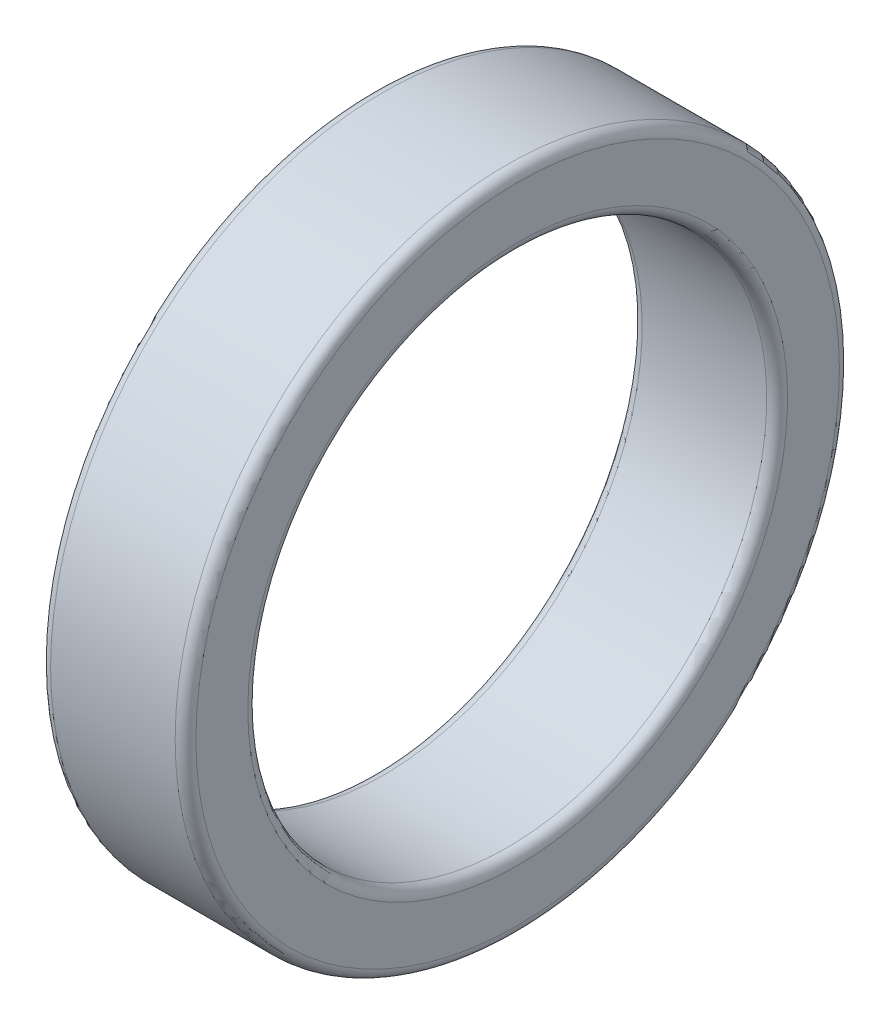
ISO-10303-21;
HEADER;
FILE_DESCRIPTION(('STEP AP214'),'2;1');
FILE_NAME('part.step','',(''),(''),'','','');
FILE_SCHEMA(('AUTOMOTIVE_DESIGN { 1 0 10303 214 1 1 1 1 }'));
ENDSEC;
DATA;
#1=APPLICATION_CONTEXT('core data for automotive mechanical design processes');
#2=APPLICATION_PROTOCOL_DEFINITION('international standard','automotive_design',2000,#1);
#3=PRODUCT_CONTEXT('',#1,'mechanical');
#4=PRODUCT('Part','Part','',(#3));
#5=PRODUCT_RELATED_PRODUCT_CATEGORY('part','',(#4));
#6=PRODUCT_DEFINITION_FORMATION('','',#4);
#7=PRODUCT_DEFINITION_CONTEXT('part definition',#1,'design');
#8=PRODUCT_DEFINITION('design','',#6,#7);
#9=PRODUCT_DEFINITION_SHAPE('','',#8);
#10=(LENGTH_UNIT() NAMED_UNIT(*) SI_UNIT(.MILLI.,.METRE.));
#11=(NAMED_UNIT(*) PLANE_ANGLE_UNIT() SI_UNIT($,.RADIAN.));
#12=(NAMED_UNIT(*) SI_UNIT($,.STERADIAN.) SOLID_ANGLE_UNIT());
#13=UNCERTAINTY_MEASURE_WITH_UNIT(LENGTH_MEASURE(1.E-05),#10,'distance_accuracy_value','');
#14=(GEOMETRIC_REPRESENTATION_CONTEXT(3) GLOBAL_UNCERTAINTY_ASSIGNED_CONTEXT((#13)) GLOBAL_UNIT_ASSIGNED_CONTEXT((#10,
#11,#12)) REPRESENTATION_CONTEXT('',''));
#15=CARTESIAN_POINT('',(0.,0.,0.));
#16=DIRECTION('',(0.,0.,1.));
#17=DIRECTION('',(1.,0.,0.));
#18=AXIS2_PLACEMENT_3D('',#15,#16,#17);
#19=CARTESIAN_POINT('',(-6.863630258,1.17999999993401E-07,0.));
#20=DIRECTION('',(1.,0.,0.));
#21=DIRECTION('',(0.,0.,-1.));
#22=AXIS2_PLACEMENT_3D('',#19,#20,#21);
#23=CYLINDRICAL_SURFACE('',#22,16.);
#24=CARTESIAN_POINT('',(-0.363630258,1.17999999993401E-07,0.));
#25=DIRECTION('',(-1.,0.,0.));
#26=DIRECTION('',(0.,0.,1.));
#27=AXIS2_PLACEMENT_3D('',#24,#25,#26);
#28=CIRCLE('',#27,16.);
#29=CARTESIAN_POINT('',(-0.363630258,1.17999999993401E-07,16.));
#30=VERTEX_POINT('',#29);
#31=EDGE_CURVE('E31',#30,#30,#28,.T.);
#32=ORIENTED_EDGE('',*,*,#31,.T.);
#33=EDGE_LOOP('',(#32));
#34=FACE_BOUND('',#33,.T.);
#35=CARTESIAN_POINT('',(-6.363630258,1.17999999993401E-07,0.));
#36=DIRECTION('',(-1.,0.,0.));
#37=DIRECTION('',(0.,0.,1.));
#38=AXIS2_PLACEMENT_3D('',#35,#36,#37);
#39=CIRCLE('',#38,16.);
#40=CARTESIAN_POINT('',(-6.363630258,1.17999999993401E-07,16.));
#41=VERTEX_POINT('',#40);
#42=EDGE_CURVE('E38',#41,#41,#39,.F.);
#43=ORIENTED_EDGE('',*,*,#42,.T.);
#44=EDGE_LOOP('',(#43));
#45=FACE_BOUND('',#44,.T.);
#46=ADVANCED_FACE('F14',(#34,#45),#23,.T.);
#47=CARTESIAN_POINT('',(-6.863630258,1.17999999993401E-07,0.));
#48=DIRECTION('',(1.,0.,0.));
#49=DIRECTION('',(0.,0.,-1.));
#50=AXIS2_PLACEMENT_3D('',#47,#48,#49);
#51=CYLINDRICAL_SURFACE('',#50,12.5);
#52=CARTESIAN_POINT('',(-0.363630258,1.17999999993401E-07,0.));
#53=DIRECTION('',(-1.,0.,0.));
#54=DIRECTION('',(0.,0.,1.));
#55=AXIS2_PLACEMENT_3D('',#52,#53,#54);
#56=CIRCLE('',#55,12.5);
#57=CARTESIAN_POINT('',(-0.363630258,1.17999999993401E-07,12.5));
#58=VERTEX_POINT('',#57);
#59=EDGE_CURVE('E43',#58,#58,#56,.F.);
#60=ORIENTED_EDGE('',*,*,#59,.T.);
#61=EDGE_LOOP('',(#60));
#62=FACE_BOUND('',#61,.T.);
#63=CARTESIAN_POINT('',(-6.363630258,1.17999999993401E-07,0.));
#64=DIRECTION('',(-1.,0.,0.));
#65=DIRECTION('',(0.,0.,1.));
#66=AXIS2_PLACEMENT_3D('',#63,#64,#65);
#67=CIRCLE('',#66,12.5);
#68=CARTESIAN_POINT('',(-6.363630258,1.17999999993401E-07,12.5));
#69=VERTEX_POINT('',#68);
#70=EDGE_CURVE('E46',#69,#69,#67,.T.);
#71=ORIENTED_EDGE('',*,*,#70,.T.);
#72=EDGE_LOOP('',(#71));
#73=FACE_BOUND('',#72,.T.);
#74=ADVANCED_FACE('F72',(#62,#73),#51,.F.);
#75=CARTESIAN_POINT('',(-6.863630258,1.17999999993401E-07,0.));
#76=DIRECTION('',(-1.,0.,0.));
#77=DIRECTION('',(0.,0.,1.));
#78=AXIS2_PLACEMENT_3D('',#75,#76,#77);
#79=PLANE('',#78);
#80=CARTESIAN_POINT('',(-6.863630258,1.17999999993401E-07,0.));
#81=DIRECTION('',(-1.,0.,0.));
#82=DIRECTION('',(0.,0.,1.));
#83=AXIS2_PLACEMENT_3D('',#80,#81,#82);
#84=CIRCLE('',#83,15.5);
#85=CARTESIAN_POINT('',(-6.863630258,1.17999999993401E-07,15.5));
#86=VERTEX_POINT('',#85);
#87=EDGE_CURVE('E9',#86,#86,#84,.T.);
#88=ORIENTED_EDGE('',*,*,#87,.T.);
#89=EDGE_LOOP('',(#88));
#90=FACE_BOUND('',#89,.T.);
#91=CARTESIAN_POINT('',(-6.863630258,1.17999999993401E-07,0.));
#92=DIRECTION('',(-1.,0.,0.));
#93=DIRECTION('',(0.,0.,1.));
#94=AXIS2_PLACEMENT_3D('',#91,#92,#93);
#95=CIRCLE('',#94,13.);
#96=CARTESIAN_POINT('',(-6.863630258,1.17999999993401E-07,13.));
#97=VERTEX_POINT('',#96);
#98=EDGE_CURVE('E22',#97,#97,#95,.F.);
#99=ORIENTED_EDGE('',*,*,#98,.T.);
#100=EDGE_LOOP('',(#99));
#101=FACE_BOUND('',#100,.T.);
#102=ADVANCED_FACE('F89',(#90,#101),#79,.T.);
#103=CARTESIAN_POINT('',(0.136369742,1.17999999993401E-07,0.));
#104=DIRECTION('',(-1.,0.,0.));
#105=DIRECTION('',(0.,0.,1.));
#106=AXIS2_PLACEMENT_3D('',#103,#104,#105);
#107=PLANE('',#106);
#108=CARTESIAN_POINT('',(0.136369742,1.17999999993401E-07,0.));
#109=DIRECTION('',(-1.,0.,0.));
#110=DIRECTION('',(0.,0.,1.));
#111=AXIS2_PLACEMENT_3D('',#108,#109,#110);
#112=CIRCLE('',#111,13.);
#113=CARTESIAN_POINT('',(0.136369742,1.17999999993401E-07,13.));
#114=VERTEX_POINT('',#113);
#115=EDGE_CURVE('E50',#114,#114,#112,.T.);
#116=ORIENTED_EDGE('',*,*,#115,.T.);
#117=EDGE_LOOP('',(#116));
#118=FACE_BOUND('',#117,.T.);
#119=CARTESIAN_POINT('',(0.136369742,1.17999999993401E-07,0.));
#120=DIRECTION('',(-1.,0.,0.));
#121=DIRECTION('',(0.,0.,1.));
#122=AXIS2_PLACEMENT_3D('',#119,#120,#121);
#123=CIRCLE('',#122,15.5);
#124=CARTESIAN_POINT('',(0.136369742,1.17999999993401E-07,15.5));
#125=VERTEX_POINT('',#124);
#126=EDGE_CURVE('E53',#125,#125,#123,.F.);
#127=ORIENTED_EDGE('',*,*,#126,.T.);
#128=EDGE_LOOP('',(#127));
#129=FACE_BOUND('',#128,.T.);
#130=ADVANCED_FACE('F60',(#118,#129),#107,.F.);
#131=CARTESIAN_POINT('',(-0.363630258,1.17999999993401E-07,0.));
#132=DIRECTION('',(-1.,0.,0.));
#133=DIRECTION('',(0.,0.,1.));
#134=AXIS2_PLACEMENT_3D('',#131,#132,#133);
#135=TOROIDAL_SURFACE('',#134,13.,0.5);
#136=ORIENTED_EDGE('',*,*,#59,.F.);
#137=EDGE_LOOP('',(#136));
#138=FACE_BOUND('',#137,.T.);
#139=ORIENTED_EDGE('',*,*,#115,.F.);
#140=EDGE_LOOP('',(#139));
#141=FACE_BOUND('',#140,.T.);
#142=ADVANCED_FACE('F66',(#138,#141),#135,.T.);
#143=CARTESIAN_POINT('',(-0.363630258,1.17999999993401E-07,0.));
#144=DIRECTION('',(-1.,0.,0.));
#145=DIRECTION('',(0.,0.,1.));
#146=AXIS2_PLACEMENT_3D('',#143,#144,#145);
#147=TOROIDAL_SURFACE('',#146,15.5,0.5);
#148=ORIENTED_EDGE('',*,*,#126,.F.);
#149=EDGE_LOOP('',(#148));
#150=FACE_BOUND('',#149,.T.);
#151=ORIENTED_EDGE('',*,*,#31,.F.);
#152=EDGE_LOOP('',(#151));
#153=FACE_BOUND('',#152,.T.);
#154=ADVANCED_FACE('F62',(#150,#153),#147,.T.);
#155=CARTESIAN_POINT('',(-6.363630258,1.17999999993401E-07,0.));
#156=DIRECTION('',(-1.,0.,0.));
#157=DIRECTION('',(0.,0.,1.));
#158=AXIS2_PLACEMENT_3D('',#155,#156,#157);
#159=TOROIDAL_SURFACE('',#158,15.5,0.5);
#160=ORIENTED_EDGE('',*,*,#42,.F.);
#161=EDGE_LOOP('',(#160));
#162=FACE_BOUND('',#161,.T.);
#163=ORIENTED_EDGE('',*,*,#87,.F.);
#164=EDGE_LOOP('',(#163));
#165=FACE_BOUND('',#164,.T.);
#166=ADVANCED_FACE('F65',(#162,#165),#159,.T.);
#167=CARTESIAN_POINT('',(-6.363630258,1.17999999993401E-07,0.));
#168=DIRECTION('',(-1.,0.,0.));
#169=DIRECTION('',(0.,0.,1.));
#170=AXIS2_PLACEMENT_3D('',#167,#168,#169);
#171=TOROIDAL_SURFACE('',#170,13.,0.5);
#172=ORIENTED_EDGE('',*,*,#98,.F.);
#173=EDGE_LOOP('',(#172));
#174=FACE_BOUND('',#173,.T.);
#175=ORIENTED_EDGE('',*,*,#70,.F.);
#176=EDGE_LOOP('',(#175));
#177=FACE_BOUND('',#176,.T.);
#178=ADVANCED_FACE('F16',(#174,#177),#171,.T.);
#179=CLOSED_SHELL('',(#46,#74,#102,#130,#142,#154,#166,#178));
#180=MANIFOLD_SOLID_BREP('B1',#179);
#181=ADVANCED_BREP_SHAPE_REPRESENTATION('',(#18,#180),#14);
#182=SHAPE_DEFINITION_REPRESENTATION(#9,#181);
ENDSEC;
END-ISO-10303-21;
